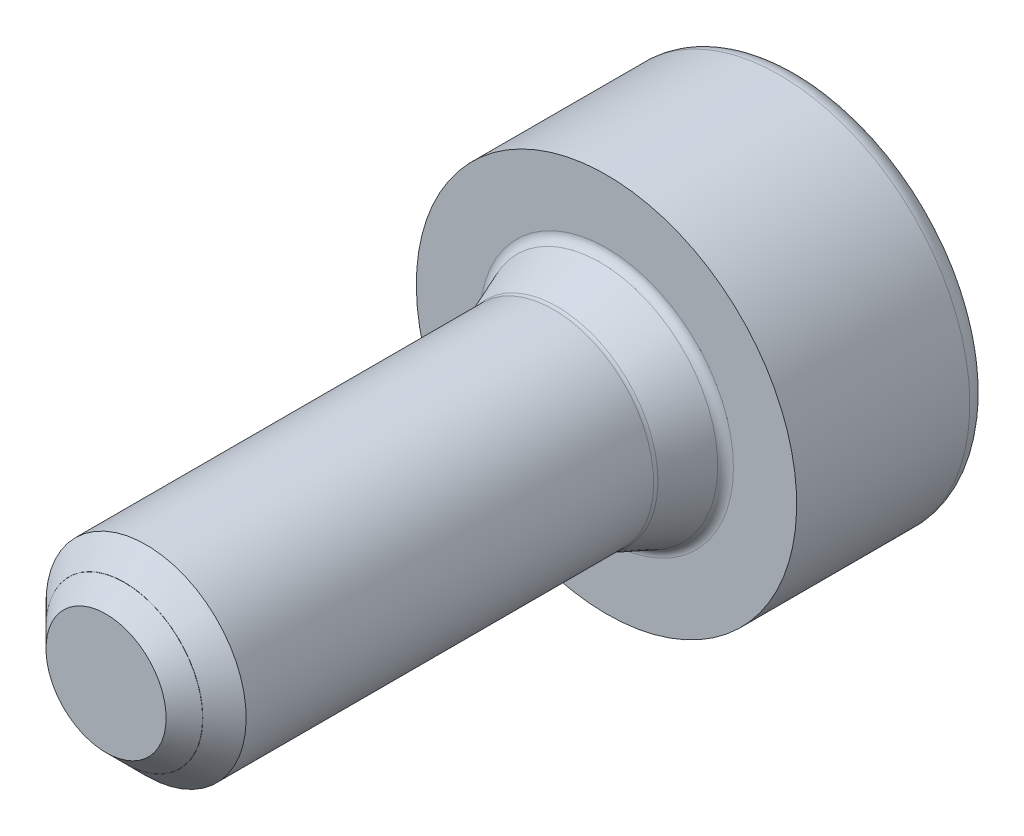
ISO-10303-21;
HEADER;
FILE_DESCRIPTION(('STEP AP214'),'2;1');
FILE_NAME('part.step','',(''),(''),'','','');
FILE_SCHEMA(('AUTOMOTIVE_DESIGN { 1 0 10303 214 1 1 1 1 }'));
ENDSEC;
DATA;
#1=APPLICATION_CONTEXT('core data for automotive mechanical design processes');
#2=APPLICATION_PROTOCOL_DEFINITION('international standard','automotive_design',2000,#1);
#3=PRODUCT_CONTEXT('',#1,'mechanical');
#4=PRODUCT('Part','Part','',(#3));
#5=PRODUCT_RELATED_PRODUCT_CATEGORY('part','',(#4));
#6=PRODUCT_DEFINITION_FORMATION('','',#4);
#7=PRODUCT_DEFINITION_CONTEXT('part definition',#1,'design');
#8=PRODUCT_DEFINITION('design','',#6,#7);
#9=PRODUCT_DEFINITION_SHAPE('','',#8);
#10=(LENGTH_UNIT() NAMED_UNIT(*) SI_UNIT(.MILLI.,.METRE.));
#11=(NAMED_UNIT(*) PLANE_ANGLE_UNIT() SI_UNIT($,.RADIAN.));
#12=(NAMED_UNIT(*) SI_UNIT($,.STERADIAN.) SOLID_ANGLE_UNIT());
#13=UNCERTAINTY_MEASURE_WITH_UNIT(LENGTH_MEASURE(1.E-05),#10,'distance_accuracy_value','');
#14=(GEOMETRIC_REPRESENTATION_CONTEXT(3) GLOBAL_UNCERTAINTY_ASSIGNED_CONTEXT((#13)) GLOBAL_UNIT_ASSIGNED_CONTEXT((#10,
#11,#12)) REPRESENTATION_CONTEXT('',''));
#15=CARTESIAN_POINT('',(0.,0.,0.));
#16=DIRECTION('',(0.,0.,1.));
#17=DIRECTION('',(1.,0.,0.));
#18=AXIS2_PLACEMENT_3D('',#15,#16,#17);
#19=CARTESIAN_POINT('',(-5.5,-10.87627944163,10.82499251967));
#20=DIRECTION('',(0.,0.,-1.));
#21=DIRECTION('',(0.500000000000017,0.866025403784429,0.));
#22=AXIS2_PLACEMENT_3D('',#19,#20,#21);
#23=CONICAL_SURFACE('',#22,0.4416729559301,1.04718484902488);
#24=CARTESIAN_POINT('',(-4.74999999999895,-11.3092921435233,10.5799853326863));
#25=CARTESIAN_POINT('',(-4.78295804289363,-11.3283204784605,10.590974855018));
#26=CARTESIAN_POINT('',(-4.81620059604793,-11.3475130754727,10.6009692526406));
#27=CARTESIAN_POINT('',(-4.88326131022354,-11.386230596854,10.6184141692276));
#28=CARTESIAN_POINT('',(-4.91708066255181,-11.4057562090246,10.6258585170578));
#29=CARTESIAN_POINT('',(-4.98430023592484,-11.4445654478063,10.637446153066));
#30=CARTESIAN_POINT('',(-5.01769011604612,-11.4638431040825,10.6416665775647));
#31=CARTESIAN_POINT('',(-5.08462691154243,-11.502489080981,10.646703904121));
#32=CARTESIAN_POINT('',(-5.11817358375703,-11.5218572612145,10.6475249789102));
#33=CARTESIAN_POINT('',(-5.1808517283671,-11.5580445048775,10.6458123276554));
#34=CARTESIAN_POINT('',(-5.20999260765192,-11.574868999377,10.6436991134807));
#35=CARTESIAN_POINT('',(-5.26808451117116,-11.6084083755115,10.6370028764792));
#36=CARTESIAN_POINT('',(-5.29703533460599,-11.6251231412149,10.6324175683589));
#37=CARTESIAN_POINT('',(-5.3552469175317,-11.658731614287,10.6209552073138));
#38=CARTESIAN_POINT('',(-5.38450031247749,-11.6756210697337,10.6140295867459));
#39=CARTESIAN_POINT('',(-5.4425708909648,-11.7091481338553,10.5983113758533));
#40=CARTESIAN_POINT('',(-5.4713888179694,-11.7257861717689,10.5895224765126));
#41=CARTESIAN_POINT('',(-5.50000001457933,-11.7423048538335,10.5799853278262));
#42=B_SPLINE_CURVE_WITH_KNOTS('',3,(#24,#25,#26,#27,#28,#29,#30,#31,#32,#33,#34,#35,#36,#37,#38,
#39,#40,#41),.UNSPECIFIED.,.F.,.F.,(4,2,2,2,2,2,2,2,4),(0.,0.118881584169771,0.238048862902882,
0.35426694561947,0.47034232724073,0.571392049926211,0.672535347232254,0.775921639476311,
0.879105015243257),.UNSPECIFIED.);
#43=CARTESIAN_POINT('',(-4.74999999999948,-11.3092921435225,10.5799853326867));
#44=VERTEX_POINT('',#43);
#45=CARTESIAN_POINT('',(-5.50000003197146,-11.7423048372112,10.5799853374234));
#46=VERTEX_POINT('',#45);
#47=EDGE_CURVE('E32',#44,#46,#42,.T.);
#48=ORIENTED_EDGE('',*,*,#47,.T.);
#49=CARTESIAN_POINT('',(-5.50000004618285,-11.7423048187524,10.5799853480809));
#50=CARTESIAN_POINT('',(-5.53295808830847,-11.7232764842592,10.5909748691515));
#51=CARTESIAN_POINT('',(-5.56620064068882,-11.7040838876939,10.6009692654338));
#52=CARTESIAN_POINT('',(-5.63326135324105,-11.6653663672498,10.6184141792376));
#53=CARTESIAN_POINT('',(-5.66708070471941,-11.64584075557,10.6258585256263));
#54=CARTESIAN_POINT('',(-5.73430027640441,-11.6070315177628,10.6374461587785));
#55=CARTESIAN_POINT('',(-5.76769015569073,-11.5877538619687,10.641666581856));
#56=CARTESIAN_POINT('',(-5.83462694941974,-11.5491078860905,10.6467039056676));
#57=CARTESIAN_POINT('',(-5.86817362070218,-11.5297397063952,10.6475249791323));
#58=CARTESIAN_POINT('',(-5.9308517601645,-11.4935524657043,10.6458123257118));
#59=CARTESIAN_POINT('',(-5.95999263525208,-11.4767279736281,10.6436991109663));
#60=CARTESIAN_POINT('',(-6.01808453038765,-11.4431886023338,10.6370028735965));
#61=CARTESIAN_POINT('',(-6.04703534963615,-11.4264738390474,10.6324175656801));
#62=CARTESIAN_POINT('',(-6.1052469240553,-11.3928653708866,10.6209552057423));
#63=CARTESIAN_POINT('',(-6.1345003146843,-11.3759759179322,10.6140295861023));
#64=CARTESIAN_POINT('',(-6.19257088467791,-11.3424488587144,10.598311377602));
#65=CARTESIAN_POINT('',(-6.22138880750511,-11.3258108232126,10.5895224797233));
#66=CARTESIAN_POINT('',(-6.2500000000014,-11.3092921435231,10.5799853326862));
#67=B_SPLINE_CURVE_WITH_KNOTS('',3,(#49,#50,#51,#52,#53,#54,#55,#56,#57,#58,#59,#60,#61,#62,#63,
#64,#65,#66),.UNSPECIFIED.,.F.,.F.,(4,2,2,2,2,2,2,2,4),(0.,0.118881580555493,0.238048855579074,
0.354266934955811,0.470342313273623,0.571392021603234,0.672535304498666,0.77592158156067,
0.87910494224808),.UNSPECIFIED.);
#68=CARTESIAN_POINT('',(-6.2500000000007,-11.3092921435215,10.5799853326869));
#69=VERTEX_POINT('',#68);
#70=EDGE_CURVE('E11',#46,#69,#67,.T.);
#71=ORIENTED_EDGE('',*,*,#70,.T.);
#72=CARTESIAN_POINT('',(-6.25,-11.3092921435197,10.5799853326878));
#73=CARTESIAN_POINT('',(-6.25,-11.2712354736509,10.5909748550179));
#74=CARTESIAN_POINT('',(-6.25,-11.2328502796321,10.6009692526391));
#75=CARTESIAN_POINT('',(-6.25,-11.1554152368816,10.6184141692241));
#76=CARTESIAN_POINT('',(-6.25,-11.1163640125471,10.6258585170536));
#77=CARTESIAN_POINT('',(-6.25,-11.0387455349848,10.6374461530635));
#78=CARTESIAN_POINT('',(-6.25,-11.0001902224269,10.6416665775637));
#79=CARTESIAN_POINT('',(-6.25,-10.9228982686179,10.6467039041216));
#80=CARTESIAN_POINT('',(-6.25,-10.8841619081444,10.647524978911));
#81=CARTESIAN_POINT('',(-6.25,-10.8117874222347,10.64581232769));
#82=CARTESIAN_POINT('',(-6.25,-10.7781384346553,10.6436991136605));
#83=CARTESIAN_POINT('',(-6.25,-10.7110596852019,10.6370028771493));
#84=CARTESIAN_POINT('',(-6.25,-10.6776301551911,10.6324175693745));
#85=CARTESIAN_POINT('',(-6.25,-10.6104132118712,10.620955209191));
#86=CARTESIAN_POINT('',(-6.25,-10.5766343024048,10.6140295891454));
#87=CARTESIAN_POINT('',(-6.25,-10.5095801769635,10.5983113794109));
#88=CARTESIAN_POINT('',(-6.25,-10.4763041025115,10.5895224807054));
#89=CARTESIAN_POINT('',(-6.25,-10.4432667397382,10.5799853326872));
#90=B_SPLINE_CURVE_WITH_KNOTS('',3,(#72,#73,#74,#75,#76,#77,#78,#79,#80,#81,#82,#83,#84,#85,#86,
#87,#88,#89),.UNSPECIFIED.,.F.,.F.,(4,2,2,2,2,2,2,2,4),(0.,0.11888158415237,0.23804886286589,
0.354266945599456,0.470342327239283,0.571392045659807,0.672535338685117,0.775921626426135,
0.87910499772433),.UNSPECIFIED.);
#91=CARTESIAN_POINT('',(-6.25000000000053,-10.4432667397375,10.5799853326867));
#92=VERTEX_POINT('',#91);
#93=EDGE_CURVE('E20',#69,#92,#90,.T.);
#94=ORIENTED_EDGE('',*,*,#93,.T.);
#95=CARTESIAN_POINT('',(-6.25000000000105,-10.4432667397367,10.5799853326863));
#96=CARTESIAN_POINT('',(-6.21704195711111,-10.4242384048023,10.5909748550164));
#97=CARTESIAN_POINT('',(-6.18379940396161,-10.4050458077928,10.6009692526377));
#98=CARTESIAN_POINT('',(-6.11673868979634,-10.3663282864175,10.6184141692228));
#99=CARTESIAN_POINT('',(-6.08291933747362,-10.3468026742501,10.6258585170524));
#100=CARTESIAN_POINT('',(-6.01569976410144,-10.3079934354689,10.6374461530624));
#101=CARTESIAN_POINT('',(-5.98230988397531,-10.2887157791899,10.6416665775627));
#102=CARTESIAN_POINT('',(-5.91537308846842,-10.2500698022853,10.6467039041207));
#103=CARTESIAN_POINT('',(-5.88182641624809,-10.2307016220484,10.6475249789101));
#104=CARTESIAN_POINT('',(-5.8191482728641,-10.1945143790934,10.6458123276892));
#105=CARTESIAN_POINT('',(-5.79000739480844,-10.1776898853035,10.6436991136597));
#106=CARTESIAN_POINT('',(-5.7319154937271,-10.1441505105765,10.6370028771486));
#107=CARTESIAN_POINT('',(-5.70296467150096,-10.1274357455709,10.6324175693737));
#108=CARTESIAN_POINT('',(-5.6447530910206,-10.0938272739107,10.62095520919));
#109=CARTESIAN_POINT('',(-5.61549969731028,-10.0769378191773,10.6140295891444));
#110=CARTESIAN_POINT('',(-5.55742912124894,-10.0434107564563,10.5983113794097));
#111=CARTESIAN_POINT('',(-5.52861119543503,-10.0267727192301,10.5895224807041));
#112=CARTESIAN_POINT('',(-5.49999999999907,-10.0102540378433,10.5799853326858));
#113=B_SPLINE_CURVE_WITH_KNOTS('',3,(#95,#96,#97,#98,#99,#100,#101,#102,#103,#104,#105,#106,
#107,#108,#109,#110,#111,#112),.UNSPECIFIED.,.F.,.F.,(4,2,2,2,2,2,2,2,4),(0.,0.11888158415274,
0.238048862866632,0.35426694560055,0.470342327240725,0.571392045662224,0.67253533868851,
0.775921626430554,0.879104997729767),.UNSPECIFIED.);
#114=CARTESIAN_POINT('',(-5.50000000000023,-10.0102540378432,10.5799853326857));
#115=VERTEX_POINT('',#114);
#116=EDGE_CURVE('E74',#92,#115,#113,.T.);
#117=ORIENTED_EDGE('',*,*,#116,.T.);
#118=CARTESIAN_POINT('',(-5.50000000000138,-10.0102540378431,10.5799853326857));
#119=CARTESIAN_POINT('',(-5.46704195710565,-10.0292823727809,10.5909748550178));
#120=CARTESIAN_POINT('',(-5.43379940395027,-10.0484749697937,10.6009692526407));
#121=CARTESIAN_POINT('',(-5.36673868977235,-10.0871924911764,10.6184141692283));
#122=CARTESIAN_POINT('',(-5.33291933744284,-10.1067181033476,10.6258585170586));
#123=CARTESIAN_POINT('',(-5.26569976406957,-10.1455273421295,10.6374461530665));
#124=CARTESIAN_POINT('',(-5.23230988394931,-10.1648049984052,10.641666577565));
#125=CARTESIAN_POINT('',(-5.16537308845522,-10.2034509753024,10.646703904121));
#126=CARTESIAN_POINT('',(-5.13182641624183,-10.2228191555352,10.6475249789102));
#127=CARTESIAN_POINT('',(-5.06914827136522,-10.259006399352,10.6458123276481));
#128=CARTESIAN_POINT('',(-5.04000739181322,-10.2758308940058,10.6436991134419));
#129=CARTESIAN_POINT('',(-4.98191548776407,-10.3093702704463,10.637002876334));
#130=CARTESIAN_POINT('',(-4.95296466406652,-10.3260850363013,10.6324175681385));
#131=CARTESIAN_POINT('',(-4.89475308060927,-10.3596935096803,10.6209552069063));
#132=CARTESIAN_POINT('',(-4.86549968539493,-10.376582965282,10.6140295862249));
#133=CARTESIAN_POINT('',(-4.80742910638029,-10.4101100297081,10.5983113750806));
#134=CARTESIAN_POINT('',(-4.77861117911688,-10.4267480677712,10.5895224756019));
#135=CARTESIAN_POINT('',(-4.74999998225177,-10.4432667499831,10.5799853267704));
#136=B_SPLINE_CURVE_WITH_KNOTS('',3,(#118,#119,#120,#121,#122,#123,#124,#125,#126,#127,#128,
#129,#130,#131,#132,#133,#134,#135),.UNSPECIFIED.,.F.,.F.,(4,2,2,2,2,2,2,2,4),(0.,
0.118881584173613,0.238048862911045,0.354266945624,0.470342327241279,0.571392050853585,
0.672535349089887,0.77592164231251,0.879105019050571),.UNSPECIFIED.);
#137=CARTESIAN_POINT('',(-4.74999999112588,-10.4432667715021,10.5799853374197));
#138=VERTEX_POINT('',#137);
#139=EDGE_CURVE('E155',#115,#138,#136,.T.);
#140=ORIENTED_EDGE('',*,*,#139,.T.);
#141=CARTESIAN_POINT('',(-4.75,-10.4432667930211,10.5799853480691));
#142=CARTESIAN_POINT('',(-4.75,-10.4813234620081,10.5909748691408));
#143=CARTESIAN_POINT('',(-4.75,-10.5197086551395,10.6009692654242));
#144=CARTESIAN_POINT('',(-4.75,-10.597143696029,10.6184141792302));
#145=CARTESIAN_POINT('',(-4.75,-10.6361949193895,10.6258585256201));
#146=CARTESIAN_POINT('',(-4.75,-10.7138133950052,10.6374461587746));
#147=CARTESIAN_POINT('',(-4.75,-10.7523687065943,10.6416665818533));
#148=CARTESIAN_POINT('',(-4.75,-10.8296606583521,10.6467039056671));
#149=CARTESIAN_POINT('',(-4.75,-10.8683970177436,10.647524979133));
#150=CARTESIAN_POINT('',(-4.75,-10.9407714991289,10.6458123257143));
#151=CARTESIAN_POINT('',(-4.75,-10.9744204832841,10.6436991109694));
#152=CARTESIAN_POINT('',(-4.75,-11.0414992258781,10.6370028736003));
#153=CARTESIAN_POINT('',(-4.75,-11.0749287524536,10.6324175656841));
#154=CARTESIAN_POINT('',(-4.75,-11.1421456887809,10.6209552057461));
#155=CARTESIAN_POINT('',(-4.75,-11.1759245946924,10.6140295861058));
#156=CARTESIAN_POINT('',(-4.75,-11.2429787131336,10.5983113776045));
#157=CARTESIAN_POINT('',(-4.75,-11.2762547841399,10.5895224797251));
#158=CARTESIAN_POINT('',(-4.75,-11.3092921435218,10.5799853326872));
#159=B_SPLINE_CURVE_WITH_KNOTS('',3,(#141,#142,#143,#144,#145,#146,#147,#148,#149,#150,#151,
#152,#153,#154,#155,#156,#157,#158),.UNSPECIFIED.,.F.,.F.,(4,2,2,2,2,2,2,2,4),(0.,
0.118881580558234,0.238048855584631,0.354266934963917,0.470342313284248,0.571392021621896,
0.672535304525398,0.775921581595917,0.879104942291782),.UNSPECIFIED.);
#160=EDGE_CURVE('E127',#138,#44,#159,.T.);
#161=ORIENTED_EDGE('',*,*,#160,.T.);
#162=EDGE_LOOP('',(#48,#71,#94,#117,#140,#161));
#163=FACE_BOUND('',#162,.T.);
#164=CARTESIAN_POINT('',(-5.5,-10.87627944163,11.0799999999987));
#165=VERTEX_POINT('',#164);
#166=VERTEX_LOOP('',#165);
#167=FACE_BOUND('',#166,.T.);
#168=ADVANCED_FACE('F16',(#163,#167),#23,.F.);
#169=CARTESIAN_POINT('',(-5.875,-11.52579849447,10.33));
#170=DIRECTION('',(-0.500000000000017,-0.866025403784429,0.));
#171=DIRECTION('',(-0.866025403784429,0.500000000000017,0.));
#172=AXIS2_PLACEMENT_3D('',#169,#170,#171);
#173=PLANE('',#172);
#174=DIRECTION('',(-0.866025403784429,0.500000000000017,0.));
#175=VECTOR('',#174,1.);
#176=CARTESIAN_POINT('',(-5.5,-11.74230484541,9.58));
#177=LINE('',#176,#175);
#178=CARTESIAN_POINT('',(-5.5,-11.74230484541,9.58));
#179=VERTEX_POINT('',#178);
#180=CARTESIAN_POINT('',(-6.25,-11.30929214352,9.58));
#181=VERTEX_POINT('',#180);
#182=EDGE_CURVE('E472',#179,#181,#177,.T.);
#183=ORIENTED_EDGE('',*,*,#182,.T.);
#184=DIRECTION('',(0.,0.,-1.));
#185=VECTOR('',#184,1.);
#186=CARTESIAN_POINT('',(-6.25,-11.30929214352,10.57998533269));
#187=LINE('',#186,#185);
#188=EDGE_CURVE('E150',#69,#181,#187,.T.);
#189=ORIENTED_EDGE('',*,*,#188,.F.);
#190=ORIENTED_EDGE('',*,*,#70,.F.);
#191=DIRECTION('',(0.,0.,-1.));
#192=VECTOR('',#191,1.);
#193=CARTESIAN_POINT('',(-5.5,-11.74230484541,10.57998533269));
#194=LINE('',#193,#192);
#195=EDGE_CURVE('E131',#46,#179,#194,.T.);
#196=ORIENTED_EDGE('',*,*,#195,.T.);
#197=EDGE_LOOP('',(#183,#189,#190,#196));
#198=FACE_BOUND('',#197,.T.);
#199=ADVANCED_FACE('F118',(#198),#173,.F.);
#200=CARTESIAN_POINT('',(-5.125,-11.52579849447,10.33));
#201=DIRECTION('',(0.500000000000017,-0.866025403784429,0.));
#202=DIRECTION('',(0.,0.,-1.));
#203=AXIS2_PLACEMENT_3D('',#200,#201,#202);
#204=PLANE('',#203);
#205=DIRECTION('',(0.866025403784429,0.500000000000017,0.));
#206=VECTOR('',#205,1.);
#207=CARTESIAN_POINT('',(-5.5,-11.74230484541,9.58));
#208=LINE('',#207,#206);
#209=CARTESIAN_POINT('',(-4.75,-11.30929214352,9.58));
#210=VERTEX_POINT('',#209);
#211=EDGE_CURVE('E135',#179,#210,#208,.T.);
#212=ORIENTED_EDGE('',*,*,#211,.F.);
#213=ORIENTED_EDGE('',*,*,#195,.F.);
#214=ORIENTED_EDGE('',*,*,#47,.F.);
#215=DIRECTION('',(0.,0.,-1.));
#216=VECTOR('',#215,1.);
#217=CARTESIAN_POINT('',(-4.75,-11.30929214352,10.57998533269));
#218=LINE('',#217,#216);
#219=EDGE_CURVE('E144',#44,#210,#218,.T.);
#220=ORIENTED_EDGE('',*,*,#219,.T.);
#221=EDGE_LOOP('',(#212,#213,#214,#220));
#222=FACE_BOUND('',#221,.T.);
#223=ADVANCED_FACE('F123',(#222),#204,.F.);
#224=CARTESIAN_POINT('',(-4.75,-10.87627944163,10.33));
#225=DIRECTION('',(1.,0.,0.));
#226=DIRECTION('',(0.,1.,0.));
#227=AXIS2_PLACEMENT_3D('',#224,#225,#226);
#228=PLANE('',#227);
#229=DIRECTION('',(0.,1.,0.));
#230=VECTOR('',#229,1.);
#231=CARTESIAN_POINT('',(-4.75,-11.30929214352,9.58));
#232=LINE('',#231,#230);
#233=CARTESIAN_POINT('',(-4.75,-10.44326673974,9.58));
#234=VERTEX_POINT('',#233);
#235=EDGE_CURVE('E461',#210,#234,#232,.T.);
#236=ORIENTED_EDGE('',*,*,#235,.F.);
#237=ORIENTED_EDGE('',*,*,#219,.F.);
#238=ORIENTED_EDGE('',*,*,#160,.F.);
#239=DIRECTION('',(0.,0.,-1.));
#240=VECTOR('',#239,1.);
#241=CARTESIAN_POINT('',(-4.75,-10.44326673974,10.57998533269));
#242=LINE('',#241,#240);
#243=EDGE_CURVE('E156',#138,#234,#242,.T.);
#244=ORIENTED_EDGE('',*,*,#243,.T.);
#245=EDGE_LOOP('',(#236,#237,#238,#244));
#246=FACE_BOUND('',#245,.T.);
#247=ADVANCED_FACE('F288',(#246),#228,.F.);
#248=CARTESIAN_POINT('',(-5.125,-10.22676038879,10.33));
#249=DIRECTION('',(0.500000000000017,0.866025403784429,0.));
#250=DIRECTION('',(0.,0.,-1.));
#251=AXIS2_PLACEMENT_3D('',#248,#249,#250);
#252=PLANE('',#251);
#253=DIRECTION('',(0.866025403784429,-0.500000000000017,0.));
#254=VECTOR('',#253,1.);
#255=CARTESIAN_POINT('',(-5.5,-10.01025403784,9.58));
#256=LINE('',#255,#254);
#257=CARTESIAN_POINT('',(-5.5,-10.01025403784,9.58));
#258=VERTEX_POINT('',#257);
#259=EDGE_CURVE('E456',#258,#234,#256,.T.);
#260=ORIENTED_EDGE('',*,*,#259,.T.);
#261=ORIENTED_EDGE('',*,*,#243,.F.);
#262=ORIENTED_EDGE('',*,*,#139,.F.);
#263=DIRECTION('',(0.,0.,-1.));
#264=VECTOR('',#263,1.);
#265=CARTESIAN_POINT('',(-5.5,-10.01025403784,10.57998533269));
#266=LINE('',#265,#264);
#267=EDGE_CURVE('E81',#115,#258,#266,.T.);
#268=ORIENTED_EDGE('',*,*,#267,.T.);
#269=EDGE_LOOP('',(#260,#261,#262,#268));
#270=FACE_BOUND('',#269,.T.);
#271=ADVANCED_FACE('F265',(#270),#252,.F.);
#272=CARTESIAN_POINT('',(-5.875,-10.22676038879,10.33));
#273=DIRECTION('',(-0.500000000000017,0.866025403784429,0.));
#274=DIRECTION('',(0.,0.,1.));
#275=AXIS2_PLACEMENT_3D('',#272,#273,#274);
#276=PLANE('',#275);
#277=DIRECTION('',(-0.866025403784429,-0.500000000000017,0.));
#278=VECTOR('',#277,1.);
#279=CARTESIAN_POINT('',(-5.5,-10.01025403784,9.58));
#280=LINE('',#279,#278);
#281=CARTESIAN_POINT('',(-6.25,-10.44326673974,9.58));
#282=VERTEX_POINT('',#281);
#283=EDGE_CURVE('E148',#258,#282,#280,.T.);
#284=ORIENTED_EDGE('',*,*,#283,.F.);
#285=ORIENTED_EDGE('',*,*,#267,.F.);
#286=ORIENTED_EDGE('',*,*,#116,.F.);
#287=DIRECTION('',(0.,0.,-1.));
#288=VECTOR('',#287,1.);
#289=CARTESIAN_POINT('',(-6.25,-10.44326673974,10.57998533269));
#290=LINE('',#289,#288);
#291=EDGE_CURVE('E161',#92,#282,#290,.T.);
#292=ORIENTED_EDGE('',*,*,#291,.T.);
#293=EDGE_LOOP('',(#284,#285,#286,#292));
#294=FACE_BOUND('',#293,.T.);
#295=ADVANCED_FACE('F242',(#294),#276,.F.);
#296=CARTESIAN_POINT('',(-6.25,-10.87627944163,10.33));
#297=DIRECTION('',(-1.,0.,0.));
#298=DIRECTION('',(0.,0.,1.));
#299=AXIS2_PLACEMENT_3D('',#296,#297,#298);
#300=PLANE('',#299);
#301=DIRECTION('',(0.,-1.,0.));
#302=VECTOR('',#301,1.);
#303=CARTESIAN_POINT('',(-6.25,-10.44326673974,9.58));
#304=LINE('',#303,#302);
#305=EDGE_CURVE('E478',#282,#181,#304,.T.);
#306=ORIENTED_EDGE('',*,*,#305,.F.);
#307=ORIENTED_EDGE('',*,*,#291,.F.);
#308=ORIENTED_EDGE('',*,*,#93,.F.);
#309=ORIENTED_EDGE('',*,*,#188,.T.);
#310=EDGE_LOOP('',(#306,#307,#308,#309));
#311=FACE_BOUND('',#310,.T.);
#312=ADVANCED_FACE('F237',(#311),#300,.F.);
#313=CARTESIAN_POINT('',(-5.5,-10.87627944163,9.58));
#314=DIRECTION('',(0.,0.,-1.));
#315=DIRECTION('',(0.,-1.,0.));
#316=AXIS2_PLACEMENT_3D('',#313,#314,#315);
#317=PLANE('',#316);
#318=CARTESIAN_POINT('',(-5.5,-10.87627944163,9.58));
#319=DIRECTION('',(0.,0.,-1.));
#320=DIRECTION('',(-0.500000000000017,-0.866025403784429,0.));
#321=AXIS2_PLACEMENT_3D('',#318,#319,#320);
#322=CIRCLE('',#321,1.7);
#323=CARTESIAN_POINT('',(-6.35000000000003,-12.3485226280635,9.58));
#324=VERTEX_POINT('',#323);
#325=EDGE_CURVE('E485',#324,#324,#322,.T.);
#326=ORIENTED_EDGE('',*,*,#325,.T.);
#327=EDGE_LOOP('',(#326));
#328=FACE_BOUND('',#327,.T.);
#329=ORIENTED_EDGE('',*,*,#305,.T.);
#330=ORIENTED_EDGE('',*,*,#182,.F.);
#331=ORIENTED_EDGE('',*,*,#211,.T.);
#332=ORIENTED_EDGE('',*,*,#235,.T.);
#333=ORIENTED_EDGE('',*,*,#259,.F.);
#334=ORIENTED_EDGE('',*,*,#283,.T.);
#335=EDGE_LOOP('',(#329,#330,#331,#332,#333,#334));
#336=FACE_BOUND('',#335,.T.);
#337=ADVANCED_FACE('F241',(#328,#336),#317,.T.);
#338=CARTESIAN_POINT('',(-5.5,-10.87627944163,9.78));
#339=DIRECTION('',(0.,0.,-1.));
#340=DIRECTION('',(0.500000000000017,0.866025403784429,0.));
#341=AXIS2_PLACEMENT_3D('',#338,#339,#340);
#342=TOROIDAL_SURFACE('',#341,1.7,0.2);
#343=ORIENTED_EDGE('',*,*,#325,.F.);
#344=EDGE_LOOP('',(#343));
#345=FACE_BOUND('',#344,.T.);
#346=CARTESIAN_POINT('',(-5.5,-10.87627944163,9.78));
#347=DIRECTION('',(0.,0.,-1.));
#348=DIRECTION('',(0.500000000000017,0.866025403784429,0.));
#349=AXIS2_PLACEMENT_3D('',#346,#347,#348);
#350=CIRCLE('',#349,1.9);
#351=CARTESIAN_POINT('',(-4.54999999999997,-9.23083117443959,9.78));
#352=VERTEX_POINT('',#351);
#353=EDGE_CURVE('E492',#352,#352,#350,.T.);
#354=ORIENTED_EDGE('',*,*,#353,.T.);
#355=EDGE_LOOP('',(#354));
#356=FACE_BOUND('',#355,.T.);
#357=ADVANCED_FACE('F246',(#345,#356),#342,.T.);
#358=CARTESIAN_POINT('',(-5.5,-10.87627944163,9.58));
#359=DIRECTION('',(0.,0.,1.));
#360=DIRECTION('',(-0.500000000000017,-0.866025403784429,0.));
#361=AXIS2_PLACEMENT_3D('',#358,#359,#360);
#362=CYLINDRICAL_SURFACE('',#361,1.9);
#363=CARTESIAN_POINT('',(-5.5,-10.87627944163,11.51));
#364=DIRECTION('',(0.,0.,1.));
#365=DIRECTION('',(-0.500000000000017,-0.866025403784429,0.));
#366=AXIS2_PLACEMENT_3D('',#363,#364,#365);
#367=CIRCLE('',#366,1.9);
#368=CARTESIAN_POINT('',(-6.45000000000003,-12.5217277088204,11.51));
#369=VERTEX_POINT('',#368);
#370=EDGE_CURVE('E496',#369,#369,#367,.T.);
#371=ORIENTED_EDGE('',*,*,#370,.F.);
#372=EDGE_LOOP('',(#371));
#373=FACE_BOUND('',#372,.T.);
#374=ORIENTED_EDGE('',*,*,#353,.F.);
#375=EDGE_LOOP('',(#374));
#376=FACE_BOUND('',#375,.T.);
#377=ADVANCED_FACE('F248',(#373,#376),#362,.T.);
#378=CARTESIAN_POINT('',(-5.5,-10.87627944163,11.51));
#379=DIRECTION('',(0.,0.,1.));
#380=DIRECTION('',(1.,0.,0.));
#381=AXIS2_PLACEMENT_3D('',#378,#379,#380);
#382=PLANE('',#381);
#383=ORIENTED_EDGE('',*,*,#370,.T.);
#384=EDGE_LOOP('',(#383));
#385=FACE_BOUND('',#384,.T.);
#386=CARTESIAN_POINT('',(-5.5,-10.87627944163,11.51));
#387=DIRECTION('',(0.,0.,-1.));
#388=DIRECTION('',(0.500000000000017,0.866025403784429,0.));
#389=AXIS2_PLACEMENT_3D('',#386,#387,#388);
#390=CIRCLE('',#389,1.268198791567);
#391=CARTESIAN_POINT('',(-4.86590060421648,-9.77798707108427,11.51));
#392=VERTEX_POINT('',#391);
#393=EDGE_CURVE('E501',#392,#392,#390,.T.);
#394=ORIENTED_EDGE('',*,*,#393,.T.);
#395=EDGE_LOOP('',(#394));
#396=FACE_BOUND('',#395,.T.);
#397=ADVANCED_FACE('F251',(#385,#396),#382,.T.);
#398=CARTESIAN_POINT('',(-5.5,-10.87627944163,11.61));
#399=DIRECTION('',(0.,0.,1.));
#400=DIRECTION('',(-0.500000000000017,-0.866025403784429,0.));
#401=AXIS2_PLACEMENT_3D('',#398,#399,#400);
#402=TOROIDAL_SURFACE('',#401,1.268198791567,0.1);
#403=ORIENTED_EDGE('',*,*,#393,.F.);
#404=EDGE_LOOP('',(#403));
#405=FACE_BOUND('',#404,.T.);
#406=CARTESIAN_POINT('',(-5.5,-10.87627944163,11.57349124712));
#407=DIRECTION('',(0.,0.,-1.));
#408=DIRECTION('',(-0.500000000000017,-0.866025403784429,0.));
#409=AXIS2_PLACEMENT_3D('',#406,#407,#408);
#410=CIRCLE('',#409,1.175101471718);
#411=CARTESIAN_POINT('',(-6.08755073585902,-11.8939471681623,11.57349124712));
#412=VERTEX_POINT('',#411);
#413=EDGE_CURVE('E539',#412,#412,#410,.T.);
#414=ORIENTED_EDGE('',*,*,#413,.T.);
#415=EDGE_LOOP('',(#414));
#416=FACE_BOUND('',#415,.T.);
#417=ADVANCED_FACE('F235',(#405,#416),#402,.F.);
#418=CARTESIAN_POINT('',(-5.5,-10.87627944163,11.78794470637));
#419=DIRECTION('',(0.,0.,-1.));
#420=DIRECTION('',(0.500000000000017,0.866025403784429,0.));
#421=AXIS2_PLACEMENT_3D('',#418,#419,#420);
#422=CONICAL_SURFACE('',#421,1.091002075935,0.373726819965523);
#423=ORIENTED_EDGE('',*,*,#413,.F.);
#424=EDGE_LOOP('',(#423));
#425=FACE_BOUND('',#424,.T.);
#426=CARTESIAN_POINT('',(-5.5,-10.87627944163,12.00239816561));
#427=DIRECTION('',(0.,0.,1.));
#428=DIRECTION('',(0.500000000000017,0.866025403784429,0.));
#429=AXIS2_PLACEMENT_3D('',#426,#427,#428);
#430=CIRCLE('',#429,1.006902680151);
#431=CARTESIAN_POINT('',(-4.99654865992448,-10.0042761414806,12.00239816561));
#432=VERTEX_POINT('',#431);
#433=EDGE_CURVE('E513',#432,#432,#430,.T.);
#434=ORIENTED_EDGE('',*,*,#433,.F.);
#435=EDGE_LOOP('',(#434));
#436=FACE_BOUND('',#435,.T.);
#437=ADVANCED_FACE('F232',(#425,#436),#422,.T.);
#438=CARTESIAN_POINT('',(-5.5,-10.87627944163,12.0389069185));
#439=DIRECTION('',(0.,0.,-1.));
#440=DIRECTION('',(0.500000000000017,0.866025403784429,0.));
#441=AXIS2_PLACEMENT_3D('',#438,#439,#440);
#442=TOROIDAL_SURFACE('',#441,1.1,0.1);
#443=CARTESIAN_POINT('',(-5.5,-10.87627944163,12.0389069185));
#444=DIRECTION('',(0.,0.,-1.));
#445=DIRECTION('',(0.500000000000017,0.866025403784429,0.));
#446=AXIS2_PLACEMENT_3D('',#443,#444,#445);
#447=CIRCLE('',#446,1.);
#448=CARTESIAN_POINT('',(-4.99999999999998,-10.0102540378456,12.0389069185));
#449=VERTEX_POINT('',#448);
#450=EDGE_CURVE('E508',#449,#449,#447,.T.);
#451=ORIENTED_EDGE('',*,*,#450,.T.);
#452=EDGE_LOOP('',(#451));
#453=FACE_BOUND('',#452,.T.);
#454=ORIENTED_EDGE('',*,*,#433,.T.);
#455=EDGE_LOOP('',(#454));
#456=FACE_BOUND('',#455,.T.);
#457=ADVANCED_FACE('F229',(#453,#456),#442,.F.);
#458=CARTESIAN_POINT('',(-5.5,-10.87627944163,11.51));
#459=DIRECTION('',(0.,0.,1.));
#460=DIRECTION('',(-0.500000000000017,-0.866025403784429,0.));
#461=AXIS2_PLACEMENT_3D('',#458,#459,#460);
#462=CYLINDRICAL_SURFACE('',#461,1.);
#463=CARTESIAN_POINT('',(-5.5,-10.87627944163,16.11));
#464=DIRECTION('',(0.,0.,1.));
#465=DIRECTION('',(0.500000000000017,0.866025403784429,0.));
#466=AXIS2_PLACEMENT_3D('',#463,#464,#465);
#467=CIRCLE('',#466,1.);
#468=CARTESIAN_POINT('',(-4.99999999999998,-10.0102540378456,16.11));
#469=VERTEX_POINT('',#468);
#470=EDGE_CURVE('E514',#469,#469,#467,.T.);
#471=ORIENTED_EDGE('',*,*,#470,.F.);
#472=EDGE_LOOP('',(#471));
#473=FACE_BOUND('',#472,.T.);
#474=ORIENTED_EDGE('',*,*,#450,.F.);
#475=EDGE_LOOP('',(#474));
#476=FACE_BOUND('',#475,.T.);
#477=ADVANCED_FACE('F224',(#473,#476),#462,.T.);
#478=CARTESIAN_POINT('',(-5.5,-10.87627944163,16.2182531754));
#479=DIRECTION('',(0.,0.,-1.));
#480=DIRECTION('',(0.500000000000017,0.866025403784429,0.));
#481=AXIS2_PLACEMENT_3D('',#478,#479,#480);
#482=CONICAL_SURFACE('',#481,0.8917468246,0.785398163397448);
#483=ORIENTED_EDGE('',*,*,#470,.T.);
#484=EDGE_LOOP('',(#483));
#485=FACE_BOUND('',#484,.T.);
#486=CARTESIAN_POINT('',(-5.5,-10.87627944163,16.3265063508));
#487=DIRECTION('',(0.,0.,-1.));
#488=DIRECTION('',(0.500000000000017,0.866025403784429,0.));
#489=AXIS2_PLACEMENT_3D('',#486,#487,#488);
#490=CIRCLE('',#489,0.7834936492);
#491=CARTESIAN_POINT('',(-5.10825317539999,-10.197754037719,16.3265063508));
#492=VERTEX_POINT('',#491);
#493=EDGE_CURVE('E522',#492,#492,#490,.T.);
#494=ORIENTED_EDGE('',*,*,#493,.T.);
#495=EDGE_LOOP('',(#494));
#496=FACE_BOUND('',#495,.T.);
#497=ADVANCED_FACE('F213',(#485,#496),#482,.T.);
#498=CARTESIAN_POINT('',(-5.5,-10.87627944163,12.71));
#499=DIRECTION('',(0.,0.,1.));
#500=DIRECTION('',(-0.500000000000017,-0.866025403784429,0.));
#501=AXIS2_PLACEMENT_3D('',#498,#499,#500);
#502=CYLINDRICAL_SURFACE('',#501,0.7834936492);
#503=ORIENTED_EDGE('',*,*,#493,.F.);
#504=EDGE_LOOP('',(#503));
#505=FACE_BOUND('',#504,.T.);
#506=CARTESIAN_POINT('',(-5.5,-10.87627944163,12.7100000000021));
#507=DIRECTION('',(0.,0.,1.));
#508=DIRECTION('',(-1.,0.,0.));
#509=AXIS2_PLACEMENT_3D('',#506,#507,#508);
#510=CIRCLE('',#509,0.7834936492);
#511=CARTESIAN_POINT('',(-6.2834936492,-10.87627944163,12.7100000000021));
#512=VERTEX_POINT('',#511);
#513=EDGE_CURVE('E529',#512,#512,#510,.T.);
#514=ORIENTED_EDGE('',*,*,#513,.F.);
#515=EDGE_LOOP('',(#514));
#516=FACE_BOUND('',#515,.T.);
#517=ADVANCED_FACE('F180',(#505,#516),#502,.F.);
#518=CARTESIAN_POINT('',(-5.5,-10.87627944163,12.31006534829));
#519=DIRECTION('',(0.,0.,-1.));
#520=DIRECTION('',(0.500000000000017,0.866025403784429,0.));
#521=AXIS2_PLACEMENT_3D('',#518,#519,#520);
#522=CONICAL_SURFACE('',#521,0.8912292208862,0.263136610985763);
#523=CARTESIAN_POINT('',(-5.5,-10.87627944163,11.9099772835759));
#524=DIRECTION('',(0.,0.,-1.));
#525=DIRECTION('',(0.500000000000017,0.866025403784429,0.));
#526=AXIS2_PLACEMENT_3D('',#523,#524,#525);
#527=CIRCLE('',#526,0.999006119417675);
#528=CARTESIAN_POINT('',(-5.00078076892179,-10.01160636929,11.91022844003));
#529=VERTEX_POINT('',#528);
#530=CARTESIAN_POINT('',(-5.99921735168298,-11.7409492587607,11.9102423933694));
#531=VERTEX_POINT('',#530);
#532=EDGE_CURVE('E109',#529,#531,#527,.T.);
#533=ORIENTED_EDGE('',*,*,#532,.T.);
#534=CARTESIAN_POINT('',(-5.5,-10.87627944163,11.91022843931));
#535=DIRECTION('',(0.,0.,-1.));
#536=DIRECTION('',(-0.500000000002049,-0.866025403783256,0.));
#537=AXIS2_PLACEMENT_3D('',#534,#535,#536);
#538=CIRCLE('',#537,0.998938462348003);
#539=EDGE_CURVE('E198',#531,#529,#538,.T.);
#540=ORIENTED_EDGE('',*,*,#539,.T.);
#541=EDGE_LOOP('',(#533,#540));
#542=FACE_BOUND('',#541,.T.);
#543=ORIENTED_EDGE('',*,*,#513,.T.);
#544=EDGE_LOOP('',(#543));
#545=FACE_BOUND('',#544,.T.);
#546=ADVANCED_FACE('F169',(#542,#545),#522,.F.);
#547=CARTESIAN_POINT('',(-5.5,-10.87627944163,12.3099397697));
#548=DIRECTION('',(0.,0.,-1.));
#549=DIRECTION('',(0.500000000000017,0.866025403784429,0.));
#550=AXIS2_PLACEMENT_3D('',#547,#548,#549);
#551=CONICAL_SURFACE('',#550,0.8902630496149,0.263136610985763);
#552=ORIENTED_EDGE('',*,*,#539,.F.);
#553=ORIENTED_EDGE('',*,*,#532,.F.);
#554=EDGE_LOOP('',(#552,#553));
#555=FACE_BOUND('',#554,.T.);
#556=CARTESIAN_POINT('',(-5.5,-10.87627944163,12.7099999999988));
#557=DIRECTION('',(0.,0.,-1.));
#558=DIRECTION('',(-1.,0.,0.));
#559=AXIS2_PLACEMENT_3D('',#556,#557,#558);
#560=CIRCLE('',#559,0.7824936492);
#561=CARTESIAN_POINT('',(-6.2824936492,-10.87627944163,12.7099999999988));
#562=VERTEX_POINT('',#561);
#563=EDGE_CURVE('E552',#562,#562,#560,.T.);
#564=ORIENTED_EDGE('',*,*,#563,.T.);
#565=EDGE_LOOP('',(#564));
#566=FACE_BOUND('',#565,.T.);
#567=ADVANCED_FACE('F179',(#555,#566),#551,.T.);
#568=CARTESIAN_POINT('',(-5.5,-10.87627944163,12.71));
#569=DIRECTION('',(0.,0.,1.));
#570=DIRECTION('',(-0.500000000000017,-0.866025403784429,0.));
#571=AXIS2_PLACEMENT_3D('',#568,#569,#570);
#572=CYLINDRICAL_SURFACE('',#571,0.7824936492);
#573=CARTESIAN_POINT('',(-5.5,-10.87627944163,16.3275063508));
#574=DIRECTION('',(0.,0.,1.));
#575=DIRECTION('',(-1.,0.,0.));
#576=AXIS2_PLACEMENT_3D('',#573,#574,#575);
#577=CIRCLE('',#576,0.7824936492);
#578=CARTESIAN_POINT('',(-6.2824936492,-10.87627944163,16.3275063508));
#579=VERTEX_POINT('',#578);
#580=EDGE_CURVE('E563',#579,#579,#577,.T.);
#581=ORIENTED_EDGE('',*,*,#580,.F.);
#582=EDGE_LOOP('',(#581));
#583=FACE_BOUND('',#582,.T.);
#584=ORIENTED_EDGE('',*,*,#563,.F.);
#585=EDGE_LOOP('',(#584));
#586=FACE_BOUND('',#585,.T.);
#587=ADVANCED_FACE('F183',(#583,#586),#572,.T.);
#588=CARTESIAN_POINT('',(-5.5,-10.87627944163,16.2182531754));
#589=DIRECTION('',(0.,0.,-1.));
#590=DIRECTION('',(0.500000000000017,0.866025403784429,0.));
#591=AXIS2_PLACEMENT_3D('',#588,#589,#590);
#592=CONICAL_SURFACE('',#591,0.8917468246,0.785398163397448);
#593=ORIENTED_EDGE('',*,*,#580,.T.);
#594=EDGE_LOOP('',(#593));
#595=FACE_BOUND('',#594,.T.);
#596=CARTESIAN_POINT('',(-5.5,-10.87627944163,16.51));
#597=DIRECTION('',(0.,0.,1.));
#598=DIRECTION('',(1.,0.,0.));
#599=AXIS2_PLACEMENT_3D('',#596,#597,#598);
#600=CIRCLE('',#599,0.6);
#601=CARTESIAN_POINT('',(-4.9,-10.87627944163,16.51));
#602=VERTEX_POINT('',#601);
#603=EDGE_CURVE('E570',#602,#602,#600,.T.);
#604=ORIENTED_EDGE('',*,*,#603,.F.);
#605=EDGE_LOOP('',(#604));
#606=FACE_BOUND('',#605,.T.);
#607=ADVANCED_FACE('F181',(#595,#606),#592,.T.);
#608=CARTESIAN_POINT('',(-5.5,-10.87627944163,16.51));
#609=DIRECTION('',(0.,0.,1.));
#610=DIRECTION('',(1.,0.,0.));
#611=AXIS2_PLACEMENT_3D('',#608,#609,#610);
#612=PLANE('',#611);
#613=ORIENTED_EDGE('',*,*,#603,.T.);
#614=EDGE_LOOP('',(#613));
#615=FACE_BOUND('',#614,.T.);
#616=ADVANCED_FACE('F400',(#615),#612,.T.);
#617=CLOSED_SHELL('',(#168,#199,#223,#247,#271,#295,#312,#337,#357,#377,#397,#417,#437,#457,
#477,#497,#517,#546,#567,#587,#607,#616));
#618=MANIFOLD_SOLID_BREP('B1',#617);
#619=ADVANCED_BREP_SHAPE_REPRESENTATION('',(#18,#618),#14);
#620=SHAPE_DEFINITION_REPRESENTATION(#9,#619);
ENDSEC;
END-ISO-10303-21;
